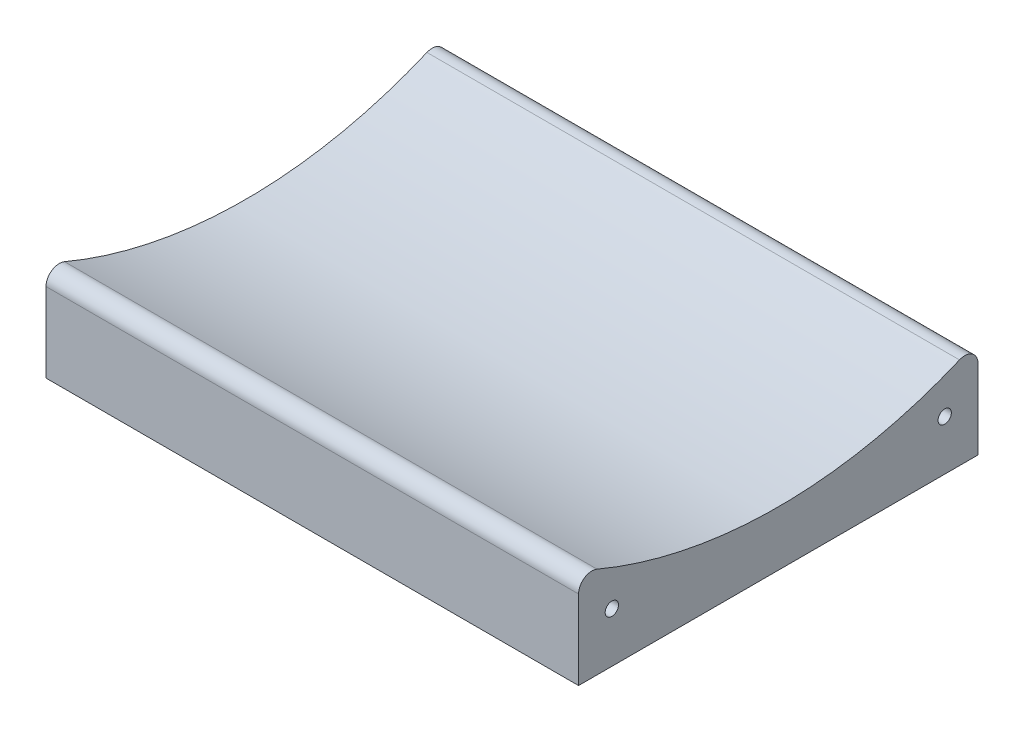
ISO-10303-21;
HEADER;
FILE_DESCRIPTION(('STEP AP214'),'2;1');
FILE_NAME('part.step','',(''),(''),'','','');
FILE_SCHEMA(('AUTOMOTIVE_DESIGN { 1 0 10303 214 1 1 1 1 }'));
ENDSEC;
DATA;
#1=APPLICATION_CONTEXT('core data for automotive mechanical design processes');
#2=APPLICATION_PROTOCOL_DEFINITION('international standard','automotive_design',2000,#1);
#3=PRODUCT_CONTEXT('',#1,'mechanical');
#4=PRODUCT('Part','Part','',(#3));
#5=PRODUCT_RELATED_PRODUCT_CATEGORY('part','',(#4));
#6=PRODUCT_DEFINITION_FORMATION('','',#4);
#7=PRODUCT_DEFINITION_CONTEXT('part definition',#1,'design');
#8=PRODUCT_DEFINITION('design','',#6,#7);
#9=PRODUCT_DEFINITION_SHAPE('','',#8);
#10=(LENGTH_UNIT() NAMED_UNIT(*) SI_UNIT(.MILLI.,.METRE.));
#11=(NAMED_UNIT(*) PLANE_ANGLE_UNIT() SI_UNIT($,.RADIAN.));
#12=(NAMED_UNIT(*) SI_UNIT($,.STERADIAN.) SOLID_ANGLE_UNIT());
#13=UNCERTAINTY_MEASURE_WITH_UNIT(LENGTH_MEASURE(1.E-05),#10,'distance_accuracy_value','');
#14=(GEOMETRIC_REPRESENTATION_CONTEXT(3) GLOBAL_UNCERTAINTY_ASSIGNED_CONTEXT((#13)) GLOBAL_UNIT_ASSIGNED_CONTEXT((#10,
#11,#12)) REPRESENTATION_CONTEXT('',''));
#15=CARTESIAN_POINT('',(0.,0.,0.));
#16=DIRECTION('',(0.,0.,1.));
#17=DIRECTION('',(1.,0.,0.));
#18=AXIS2_PLACEMENT_3D('',#15,#16,#17);
#19=CARTESIAN_POINT('',(80.,0.,30.));
#20=DIRECTION('',(0.,0.,-1.));
#21=DIRECTION('',(-1.,0.,0.));
#22=AXIS2_PLACEMENT_3D('',#19,#20,#21);
#23=PLANE('',#22);
#24=DIRECTION('',(0.,-1.,0.));
#25=VECTOR('',#24,1.);
#26=CARTESIAN_POINT('',(80.,0.,30.));
#27=LINE('',#26,#25);
#28=CARTESIAN_POINT('',(80.,11.9130573962596,30.));
#29=VERTEX_POINT('',#28);
#30=CARTESIAN_POINT('',(80.,0.,30.));
#31=VERTEX_POINT('',#30);
#32=EDGE_CURVE('E100',#29,#31,#27,.T.);
#33=ORIENTED_EDGE('',*,*,#32,.F.);
#34=DIRECTION('',(-1.,0.,0.));
#35=VECTOR('',#34,1.);
#36=CARTESIAN_POINT('',(80.,11.9130573962596,30.));
#37=LINE('',#36,#35);
#38=CARTESIAN_POINT('',(0.,11.9130573962596,30.));
#39=VERTEX_POINT('',#38);
#40=EDGE_CURVE('E13',#29,#39,#37,.T.);
#41=ORIENTED_EDGE('',*,*,#40,.T.);
#42=DIRECTION('',(0.,-1.,0.));
#43=VECTOR('',#42,1.);
#44=CARTESIAN_POINT('',(0.,0.,30.));
#45=LINE('',#44,#43);
#46=CARTESIAN_POINT('',(0.,0.,30.));
#47=VERTEX_POINT('',#46);
#48=EDGE_CURVE('E119',#39,#47,#45,.T.);
#49=ORIENTED_EDGE('',*,*,#48,.T.);
#50=DIRECTION('',(-1.,0.,0.));
#51=VECTOR('',#50,1.);
#52=CARTESIAN_POINT('',(80.,0.,30.));
#53=LINE('',#52,#51);
#54=EDGE_CURVE('E113',#31,#47,#53,.T.);
#55=ORIENTED_EDGE('',*,*,#54,.F.);
#56=EDGE_LOOP('',(#33,#41,#49,#55));
#57=FACE_BOUND('',#56,.T.);
#58=ADVANCED_FACE('F47',(#57),#23,.F.);
#59=CARTESIAN_POINT('',(80.,0.,30.));
#60=DIRECTION('',(0.,1.,0.));
#61=DIRECTION('',(0.,0.,1.));
#62=AXIS2_PLACEMENT_3D('',#59,#60,#61);
#63=PLANE('',#62);
#64=DIRECTION('',(0.,0.,-1.));
#65=VECTOR('',#64,1.);
#66=CARTESIAN_POINT('',(0.,0.,30.));
#67=LINE('',#66,#65);
#68=CARTESIAN_POINT('',(0.,0.,-30.));
#69=VERTEX_POINT('',#68);
#70=EDGE_CURVE('E152',#47,#69,#67,.T.);
#71=ORIENTED_EDGE('',*,*,#70,.T.);
#72=DIRECTION('',(-1.,0.,0.));
#73=VECTOR('',#72,1.);
#74=CARTESIAN_POINT('',(80.,0.,-30.));
#75=LINE('',#74,#73);
#76=CARTESIAN_POINT('',(80.,0.,-30.));
#77=VERTEX_POINT('',#76);
#78=EDGE_CURVE('E115',#77,#69,#75,.T.);
#79=ORIENTED_EDGE('',*,*,#78,.F.);
#80=DIRECTION('',(0.,0.,-1.));
#81=VECTOR('',#80,1.);
#82=CARTESIAN_POINT('',(80.,0.,30.));
#83=LINE('',#82,#81);
#84=EDGE_CURVE('E103',#31,#77,#83,.T.);
#85=ORIENTED_EDGE('',*,*,#84,.F.);
#86=ORIENTED_EDGE('',*,*,#54,.T.);
#87=EDGE_LOOP('',(#71,#79,#85,#86));
#88=FACE_BOUND('',#87,.T.);
#89=ADVANCED_FACE('F112',(#88),#63,.F.);
#90=CARTESIAN_POINT('',(80.,0.,-30.));
#91=DIRECTION('',(0.,0.,1.));
#92=DIRECTION('',(1.,0.,0.));
#93=AXIS2_PLACEMENT_3D('',#90,#91,#92);
#94=PLANE('',#93);
#95=DIRECTION('',(0.,1.,0.));
#96=VECTOR('',#95,1.);
#97=CARTESIAN_POINT('',(0.,0.,-30.));
#98=LINE('',#97,#96);
#99=CARTESIAN_POINT('',(0.,11.9130573962596,-30.));
#100=VERTEX_POINT('',#99);
#101=EDGE_CURVE('E150',#69,#100,#98,.T.);
#102=ORIENTED_EDGE('',*,*,#101,.T.);
#103=DIRECTION('',(-1.,0.,0.));
#104=VECTOR('',#103,1.);
#105=CARTESIAN_POINT('',(80.,11.9130573962596,-30.));
#106=LINE('',#105,#104);
#107=CARTESIAN_POINT('',(80.,11.9130573962596,-30.));
#108=VERTEX_POINT('',#107);
#109=EDGE_CURVE('E70',#100,#108,#106,.F.);
#110=ORIENTED_EDGE('',*,*,#109,.T.);
#111=DIRECTION('',(0.,1.,0.));
#112=VECTOR('',#111,1.);
#113=CARTESIAN_POINT('',(80.,0.,-30.));
#114=LINE('',#113,#112);
#115=EDGE_CURVE('E116',#77,#108,#114,.T.);
#116=ORIENTED_EDGE('',*,*,#115,.F.);
#117=ORIENTED_EDGE('',*,*,#78,.T.);
#118=EDGE_LOOP('',(#102,#110,#116,#117));
#119=FACE_BOUND('',#118,.T.);
#120=ADVANCED_FACE('F151',(#119),#94,.F.);
#121=CARTESIAN_POINT('',(80.,78.2455532033676,0.));
#122=DIRECTION('',(-1.,0.,0.));
#123=DIRECTION('',(0.,0.,1.));
#124=AXIS2_PLACEMENT_3D('',#121,#122,#123);
#125=CYLINDRICAL_SURFACE('',#124,70.);
#126=CARTESIAN_POINT('',(80.,78.2455532033676,0.));
#127=DIRECTION('',(-1.,0.,0.));
#128=DIRECTION('',(0.,0.,-1.));
#129=AXIS2_PLACEMENT_3D('',#126,#127,#128);
#130=CIRCLE('',#129,70.);
#131=CARTESIAN_POINT('',(80.,13.7556267242348,-27.2222222222222));
#132=VERTEX_POINT('',#131);
#133=CARTESIAN_POINT('',(80.,13.7556267242348,27.2222222222222));
#134=VERTEX_POINT('',#133);
#135=EDGE_CURVE('E125',#132,#134,#130,.T.);
#136=ORIENTED_EDGE('',*,*,#135,.F.);
#137=DIRECTION('',(-1.,0.,0.));
#138=VECTOR('',#137,1.);
#139=CARTESIAN_POINT('',(80.,13.7556267242348,-27.2222222222222));
#140=LINE('',#139,#138);
#141=CARTESIAN_POINT('',(0.,13.7556267242348,-27.2222222222222));
#142=VERTEX_POINT('',#141);
#143=EDGE_CURVE('E123',#132,#142,#140,.T.);
#144=ORIENTED_EDGE('',*,*,#143,.T.);
#145=CARTESIAN_POINT('',(0.,78.2455532033676,0.));
#146=DIRECTION('',(-1.,0.,0.));
#147=DIRECTION('',(0.,0.,-1.));
#148=AXIS2_PLACEMENT_3D('',#145,#146,#147);
#149=CIRCLE('',#148,70.);
#150=CARTESIAN_POINT('',(0.,13.7556267242348,27.2222222222222));
#151=VERTEX_POINT('',#150);
#152=EDGE_CURVE('E108',#142,#151,#149,.T.);
#153=ORIENTED_EDGE('',*,*,#152,.T.);
#154=DIRECTION('',(-1.,0.,0.));
#155=VECTOR('',#154,1.);
#156=CARTESIAN_POINT('',(80.,13.7556267242348,27.2222222222222));
#157=LINE('',#156,#155);
#158=EDGE_CURVE('E121',#151,#134,#157,.F.);
#159=ORIENTED_EDGE('',*,*,#158,.T.);
#160=EDGE_LOOP('',(#136,#144,#153,#159));
#161=FACE_BOUND('',#160,.T.);
#162=ADVANCED_FACE('F141',(#161),#125,.F.);
#163=CARTESIAN_POINT('',(80.,78.2455532033676,0.));
#164=DIRECTION('',(1.,0.,0.));
#165=DIRECTION('',(0.,0.,-1.));
#166=AXIS2_PLACEMENT_3D('',#163,#164,#165);
#167=PLANE('',#166);
#168=CARTESIAN_POINT('',(80.,7.5,25.));
#169=DIRECTION('',(1.,0.,0.));
#170=DIRECTION('',(0.,0.,-1.));
#171=AXIS2_PLACEMENT_3D('',#168,#169,#170);
#172=CIRCLE('',#171,1.);
#173=CARTESIAN_POINT('',(80.,7.5,24.));
#174=VERTEX_POINT('',#173);
#175=EDGE_CURVE('E166',#174,#174,#172,.T.);
#176=ORIENTED_EDGE('',*,*,#175,.F.);
#177=EDGE_LOOP('',(#176));
#178=FACE_BOUND('',#177,.T.);
#179=CARTESIAN_POINT('',(80.,7.50000000000001,-25.));
#180=DIRECTION('',(1.,0.,0.));
#181=DIRECTION('',(0.,0.,-1.));
#182=AXIS2_PLACEMENT_3D('',#179,#180,#181);
#183=CIRCLE('',#182,1.);
#184=CARTESIAN_POINT('',(80.,7.50000000000001,-26.));
#185=VERTEX_POINT('',#184);
#186=EDGE_CURVE('E159',#185,#185,#183,.T.);
#187=ORIENTED_EDGE('',*,*,#186,.F.);
#188=EDGE_LOOP('',(#187));
#189=FACE_BOUND('',#188,.T.);
#190=ORIENTED_EDGE('',*,*,#115,.T.);
#191=CARTESIAN_POINT('',(80.,11.9130573962596,-28.));
#192=DIRECTION('',(1.,0.,0.));
#193=DIRECTION('',(0.,0.,-1.));
#194=AXIS2_PLACEMENT_3D('',#191,#192,#193);
#195=CIRCLE('',#194,2.);
#196=EDGE_CURVE('E55',#108,#132,#195,.T.);
#197=ORIENTED_EDGE('',*,*,#196,.T.);
#198=ORIENTED_EDGE('',*,*,#135,.T.);
#199=CARTESIAN_POINT('',(80.,11.9130573962596,28.));
#200=DIRECTION('',(1.,0.,0.));
#201=DIRECTION('',(0.,0.,-1.));
#202=AXIS2_PLACEMENT_3D('',#199,#200,#201);
#203=CIRCLE('',#202,2.);
#204=EDGE_CURVE('E62',#134,#29,#203,.T.);
#205=ORIENTED_EDGE('',*,*,#204,.T.);
#206=ORIENTED_EDGE('',*,*,#32,.T.);
#207=ORIENTED_EDGE('',*,*,#84,.T.);
#208=EDGE_LOOP('',(#190,#197,#198,#205,#206,#207));
#209=FACE_BOUND('',#208,.T.);
#210=ADVANCED_FACE('F102',(#178,#189,#209),#167,.T.);
#211=CARTESIAN_POINT('',(0.,78.2455532033676,0.));
#212=DIRECTION('',(1.,0.,0.));
#213=DIRECTION('',(0.,0.,-1.));
#214=AXIS2_PLACEMENT_3D('',#211,#212,#213);
#215=PLANE('',#214);
#216=CARTESIAN_POINT('',(0.,7.5,25.));
#217=DIRECTION('',(1.,0.,0.));
#218=DIRECTION('',(0.,0.,-1.));
#219=AXIS2_PLACEMENT_3D('',#216,#217,#218);
#220=CIRCLE('',#219,1.);
#221=CARTESIAN_POINT('',(0.,7.5,24.));
#222=VERTEX_POINT('',#221);
#223=EDGE_CURVE('E177',#222,#222,#220,.T.);
#224=ORIENTED_EDGE('',*,*,#223,.T.);
#225=EDGE_LOOP('',(#224));
#226=FACE_BOUND('',#225,.T.);
#227=CARTESIAN_POINT('',(0.,7.50000000000001,-25.));
#228=DIRECTION('',(1.,0.,0.));
#229=DIRECTION('',(0.,0.,-1.));
#230=AXIS2_PLACEMENT_3D('',#227,#228,#229);
#231=CIRCLE('',#230,1.);
#232=CARTESIAN_POINT('',(0.,7.50000000000001,-26.));
#233=VERTEX_POINT('',#232);
#234=EDGE_CURVE('E171',#233,#233,#231,.T.);
#235=ORIENTED_EDGE('',*,*,#234,.T.);
#236=EDGE_LOOP('',(#235));
#237=FACE_BOUND('',#236,.T.);
#238=ORIENTED_EDGE('',*,*,#152,.F.);
#239=CARTESIAN_POINT('',(0.,11.9130573962596,-28.));
#240=DIRECTION('',(1.,0.,0.));
#241=DIRECTION('',(0.,0.,-1.));
#242=AXIS2_PLACEMENT_3D('',#239,#240,#241);
#243=CIRCLE('',#242,2.);
#244=EDGE_CURVE('E133',#142,#100,#243,.F.);
#245=ORIENTED_EDGE('',*,*,#244,.T.);
#246=ORIENTED_EDGE('',*,*,#101,.F.);
#247=ORIENTED_EDGE('',*,*,#70,.F.);
#248=ORIENTED_EDGE('',*,*,#48,.F.);
#249=CARTESIAN_POINT('',(0.,11.9130573962596,28.));
#250=DIRECTION('',(1.,0.,0.));
#251=DIRECTION('',(0.,0.,-1.));
#252=AXIS2_PLACEMENT_3D('',#249,#250,#251);
#253=CIRCLE('',#252,2.);
#254=EDGE_CURVE('E131',#39,#151,#253,.F.);
#255=ORIENTED_EDGE('',*,*,#254,.T.);
#256=EDGE_LOOP('',(#238,#245,#246,#247,#248,#255));
#257=FACE_BOUND('',#256,.T.);
#258=ADVANCED_FACE('F149',(#226,#237,#257),#215,.F.);
#259=CARTESIAN_POINT('',(80.,11.9130573962596,-28.));
#260=DIRECTION('',(-1.,0.,0.));
#261=DIRECTION('',(0.,0.,1.));
#262=AXIS2_PLACEMENT_3D('',#259,#260,#261);
#263=CYLINDRICAL_SURFACE('',#262,2.);
#264=ORIENTED_EDGE('',*,*,#196,.F.);
#265=ORIENTED_EDGE('',*,*,#109,.F.);
#266=ORIENTED_EDGE('',*,*,#244,.F.);
#267=ORIENTED_EDGE('',*,*,#143,.F.);
#268=EDGE_LOOP('',(#264,#265,#266,#267));
#269=FACE_BOUND('',#268,.T.);
#270=ADVANCED_FACE('F146',(#269),#263,.T.);
#271=CARTESIAN_POINT('',(80.,11.9130573962596,28.));
#272=DIRECTION('',(-1.,0.,0.));
#273=DIRECTION('',(0.,0.,1.));
#274=AXIS2_PLACEMENT_3D('',#271,#272,#273);
#275=CYLINDRICAL_SURFACE('',#274,2.);
#276=ORIENTED_EDGE('',*,*,#204,.F.);
#277=ORIENTED_EDGE('',*,*,#158,.F.);
#278=ORIENTED_EDGE('',*,*,#254,.F.);
#279=ORIENTED_EDGE('',*,*,#40,.F.);
#280=EDGE_LOOP('',(#276,#277,#278,#279));
#281=FACE_BOUND('',#280,.T.);
#282=ADVANCED_FACE('F49',(#281),#275,.T.);
#283=CARTESIAN_POINT('',(75.,7.50000000000001,-25.));
#284=DIRECTION('',(1.,0.,0.));
#285=DIRECTION('',(0.,0.,-1.));
#286=AXIS2_PLACEMENT_3D('',#283,#284,#285);
#287=CYLINDRICAL_SURFACE('',#286,1.);
#288=CARTESIAN_POINT('',(75.,7.50000000000001,-25.));
#289=DIRECTION('',(1.,0.,0.));
#290=DIRECTION('',(0.,0.,-1.));
#291=AXIS2_PLACEMENT_3D('',#288,#289,#290);
#292=CIRCLE('',#291,1.);
#293=CARTESIAN_POINT('',(75.,7.50000000000001,-26.));
#294=VERTEX_POINT('',#293);
#295=EDGE_CURVE('E162',#294,#294,#292,.T.);
#296=ORIENTED_EDGE('',*,*,#295,.F.);
#297=EDGE_LOOP('',(#296));
#298=FACE_BOUND('',#297,.T.);
#299=ORIENTED_EDGE('',*,*,#186,.T.);
#300=EDGE_LOOP('',(#299));
#301=FACE_BOUND('',#300,.T.);
#302=ADVANCED_FACE('F206',(#298,#301),#287,.F.);
#303=CARTESIAN_POINT('',(75.,7.50000000000001,-25.));
#304=DIRECTION('',(1.,0.,0.));
#305=DIRECTION('',(0.,0.,-1.));
#306=AXIS2_PLACEMENT_3D('',#303,#304,#305);
#307=PLANE('',#306);
#308=ORIENTED_EDGE('',*,*,#295,.T.);
#309=EDGE_LOOP('',(#308));
#310=FACE_BOUND('',#309,.T.);
#311=ADVANCED_FACE('F245',(#310),#307,.T.);
#312=CARTESIAN_POINT('',(75.,7.5,25.));
#313=DIRECTION('',(1.,0.,0.));
#314=DIRECTION('',(0.,0.,-1.));
#315=AXIS2_PLACEMENT_3D('',#312,#313,#314);
#316=CYLINDRICAL_SURFACE('',#315,1.);
#317=CARTESIAN_POINT('',(75.,7.5,25.));
#318=DIRECTION('',(1.,0.,0.));
#319=DIRECTION('',(0.,0.,-1.));
#320=AXIS2_PLACEMENT_3D('',#317,#318,#319);
#321=CIRCLE('',#320,1.);
#322=CARTESIAN_POINT('',(75.,7.5,24.));
#323=VERTEX_POINT('',#322);
#324=EDGE_CURVE('E156',#323,#323,#321,.T.);
#325=ORIENTED_EDGE('',*,*,#324,.F.);
#326=EDGE_LOOP('',(#325));
#327=FACE_BOUND('',#326,.T.);
#328=ORIENTED_EDGE('',*,*,#175,.T.);
#329=EDGE_LOOP('',(#328));
#330=FACE_BOUND('',#329,.T.);
#331=ADVANCED_FACE('F254',(#327,#330),#316,.F.);
#332=CARTESIAN_POINT('',(75.,7.5,25.));
#333=DIRECTION('',(1.,0.,0.));
#334=DIRECTION('',(0.,0.,-1.));
#335=AXIS2_PLACEMENT_3D('',#332,#333,#334);
#336=PLANE('',#335);
#337=ORIENTED_EDGE('',*,*,#324,.T.);
#338=EDGE_LOOP('',(#337));
#339=FACE_BOUND('',#338,.T.);
#340=ADVANCED_FACE('F264',(#339),#336,.T.);
#341=CARTESIAN_POINT('',(5.,7.50000000000001,-25.));
#342=DIRECTION('',(-1.,0.,0.));
#343=DIRECTION('',(0.,0.,1.));
#344=AXIS2_PLACEMENT_3D('',#341,#342,#343);
#345=CYLINDRICAL_SURFACE('',#344,1.);
#346=CARTESIAN_POINT('',(5.,7.50000000000001,-25.));
#347=DIRECTION('',(1.,0.,0.));
#348=DIRECTION('',(0.,0.,-1.));
#349=AXIS2_PLACEMENT_3D('',#346,#347,#348);
#350=CIRCLE('',#349,1.);
#351=CARTESIAN_POINT('',(5.,7.50000000000001,-26.));
#352=VERTEX_POINT('',#351);
#353=EDGE_CURVE('E174',#352,#352,#350,.T.);
#354=ORIENTED_EDGE('',*,*,#353,.T.);
#355=EDGE_LOOP('',(#354));
#356=FACE_BOUND('',#355,.T.);
#357=ORIENTED_EDGE('',*,*,#234,.F.);
#358=EDGE_LOOP('',(#357));
#359=FACE_BOUND('',#358,.T.);
#360=ADVANCED_FACE('F273',(#356,#359),#345,.F.);
#361=CARTESIAN_POINT('',(5.,7.50000000000001,-25.));
#362=DIRECTION('',(-1.,0.,0.));
#363=DIRECTION('',(0.,0.,-1.));
#364=AXIS2_PLACEMENT_3D('',#361,#362,#363);
#365=PLANE('',#364);
#366=ORIENTED_EDGE('',*,*,#353,.F.);
#367=EDGE_LOOP('',(#366));
#368=FACE_BOUND('',#367,.T.);
#369=ADVANCED_FACE('F192',(#368),#365,.T.);
#370=CARTESIAN_POINT('',(5.,7.5,25.));
#371=DIRECTION('',(-1.,0.,0.));
#372=DIRECTION('',(0.,0.,1.));
#373=AXIS2_PLACEMENT_3D('',#370,#371,#372);
#374=CYLINDRICAL_SURFACE('',#373,1.);
#375=CARTESIAN_POINT('',(5.,7.5,25.));
#376=DIRECTION('',(1.,0.,0.));
#377=DIRECTION('',(0.,0.,-1.));
#378=AXIS2_PLACEMENT_3D('',#375,#376,#377);
#379=CIRCLE('',#378,1.);
#380=CARTESIAN_POINT('',(5.,7.5,24.));
#381=VERTEX_POINT('',#380);
#382=EDGE_CURVE('E163',#381,#381,#379,.T.);
#383=ORIENTED_EDGE('',*,*,#382,.T.);
#384=EDGE_LOOP('',(#383));
#385=FACE_BOUND('',#384,.T.);
#386=ORIENTED_EDGE('',*,*,#223,.F.);
#387=EDGE_LOOP('',(#386));
#388=FACE_BOUND('',#387,.T.);
#389=ADVANCED_FACE('F183',(#385,#388),#374,.F.);
#390=CARTESIAN_POINT('',(5.,7.5,25.));
#391=DIRECTION('',(-1.,0.,0.));
#392=DIRECTION('',(0.,0.,-1.));
#393=AXIS2_PLACEMENT_3D('',#390,#391,#392);
#394=PLANE('',#393);
#395=ORIENTED_EDGE('',*,*,#382,.F.);
#396=EDGE_LOOP('',(#395));
#397=FACE_BOUND('',#396,.T.);
#398=ADVANCED_FACE('F186',(#397),#394,.T.);
#399=CLOSED_SHELL('',(#58,#89,#120,#162,#210,#258,#270,#282,#302,#311,#331,#340,#360,#369,#389,#398));
#400=MANIFOLD_SOLID_BREP('B2',#399);
#401=ADVANCED_BREP_SHAPE_REPRESENTATION('',(#18,#400),#14);
#402=SHAPE_DEFINITION_REPRESENTATION(#9,#401);
ENDSEC;
END-ISO-10303-21;
